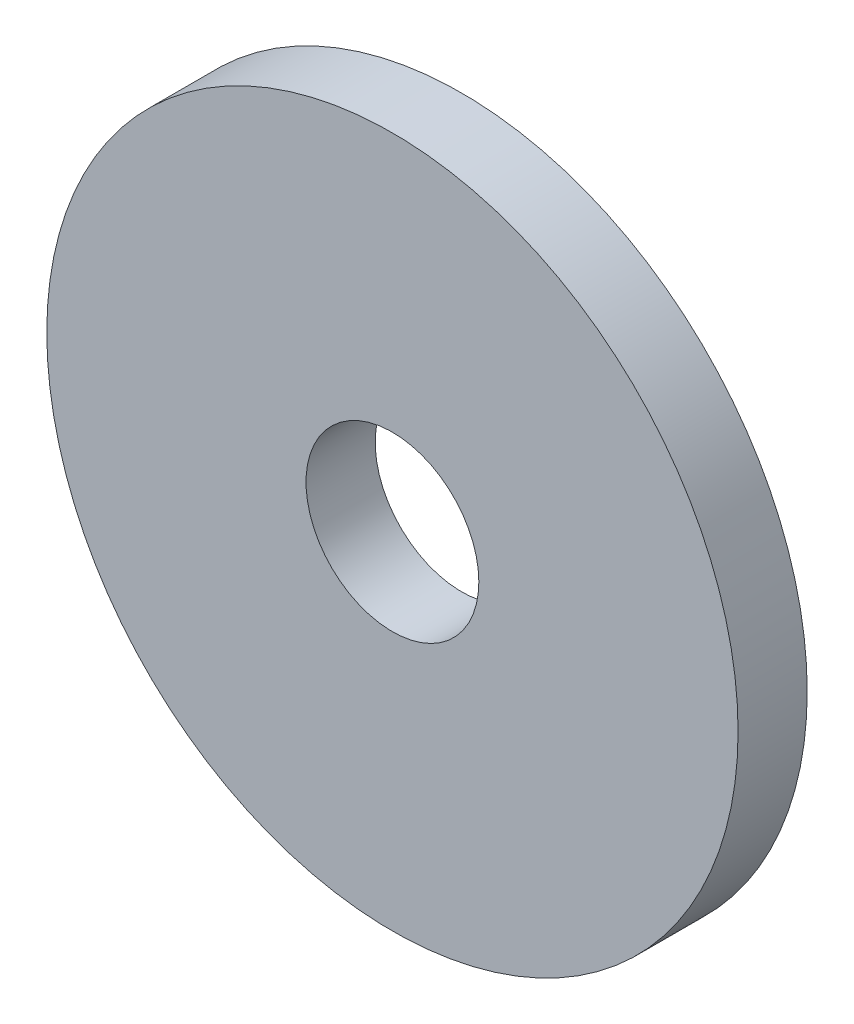
ISO-10303-21;
HEADER;
FILE_DESCRIPTION(('STEP AP214'),'2;1');
FILE_NAME('part.step','',(''),(''),'','','');
FILE_SCHEMA(('AUTOMOTIVE_DESIGN { 1 0 10303 214 1 1 1 1 }'));
ENDSEC;
DATA;
#1=APPLICATION_CONTEXT('core data for automotive mechanical design processes');
#2=APPLICATION_PROTOCOL_DEFINITION('international standard','automotive_design',2000,#1);
#3=PRODUCT_CONTEXT('',#1,'mechanical');
#4=PRODUCT('Part','Part','',(#3));
#5=PRODUCT_RELATED_PRODUCT_CATEGORY('part','',(#4));
#6=PRODUCT_DEFINITION_FORMATION('','',#4);
#7=PRODUCT_DEFINITION_CONTEXT('part definition',#1,'design');
#8=PRODUCT_DEFINITION('design','',#6,#7);
#9=PRODUCT_DEFINITION_SHAPE('','',#8);
#10=(LENGTH_UNIT() NAMED_UNIT(*) SI_UNIT(.MILLI.,.METRE.));
#11=(NAMED_UNIT(*) PLANE_ANGLE_UNIT() SI_UNIT($,.RADIAN.));
#12=(NAMED_UNIT(*) SI_UNIT($,.STERADIAN.) SOLID_ANGLE_UNIT());
#13=UNCERTAINTY_MEASURE_WITH_UNIT(LENGTH_MEASURE(1.E-05),#10,'distance_accuracy_value','');
#14=(GEOMETRIC_REPRESENTATION_CONTEXT(3) GLOBAL_UNCERTAINTY_ASSIGNED_CONTEXT((#13)) GLOBAL_UNIT_ASSIGNED_CONTEXT((#10,
#11,#12)) REPRESENTATION_CONTEXT('',''));
#15=CARTESIAN_POINT('',(0.,0.,0.));
#16=DIRECTION('',(0.,0.,1.));
#17=DIRECTION('',(1.,0.,0.));
#18=AXIS2_PLACEMENT_3D('',#15,#16,#17);
#19=CARTESIAN_POINT('',(0.,0.,2.));
#20=DIRECTION('',(0.,0.,-1.));
#21=DIRECTION('',(-1.,0.,0.));
#22=AXIS2_PLACEMENT_3D('',#19,#20,#21);
#23=CYLINDRICAL_SURFACE('',#22,10.);
#24=CARTESIAN_POINT('',(0.,0.,2.));
#25=DIRECTION('',(0.,0.,1.));
#26=DIRECTION('',(1.,0.,0.));
#27=AXIS2_PLACEMENT_3D('',#24,#25,#26);
#28=CIRCLE('',#27,10.);
#29=CARTESIAN_POINT('',(10.,0.,2.));
#30=VERTEX_POINT('',#29);
#31=EDGE_CURVE('E10',#30,#30,#28,.T.);
#32=ORIENTED_EDGE('',*,*,#31,.F.);
#33=EDGE_LOOP('',(#32));
#34=FACE_BOUND('',#33,.T.);
#35=CARTESIAN_POINT('',(0.,0.,0.));
#36=DIRECTION('',(0.,0.,1.));
#37=DIRECTION('',(1.,0.,0.));
#38=AXIS2_PLACEMENT_3D('',#35,#36,#37);
#39=CIRCLE('',#38,10.);
#40=CARTESIAN_POINT('',(10.,0.,0.));
#41=VERTEX_POINT('',#40);
#42=EDGE_CURVE('E40',#41,#41,#39,.T.);
#43=ORIENTED_EDGE('',*,*,#42,.T.);
#44=EDGE_LOOP('',(#43));
#45=FACE_BOUND('',#44,.T.);
#46=ADVANCED_FACE('F37',(#34,#45),#23,.T.);
#47=CARTESIAN_POINT('',(0.,0.,2.));
#48=DIRECTION('',(0.,0.,1.));
#49=DIRECTION('',(1.,0.,0.));
#50=AXIS2_PLACEMENT_3D('',#47,#48,#49);
#51=PLANE('',#50);
#52=CARTESIAN_POINT('',(0.,0.,2.));
#53=DIRECTION('',(0.,0.,1.));
#54=DIRECTION('',(1.,0.,0.));
#55=AXIS2_PLACEMENT_3D('',#52,#53,#54);
#56=CIRCLE('',#55,2.5);
#57=CARTESIAN_POINT('',(2.5,0.,2.));
#58=VERTEX_POINT('',#57);
#59=EDGE_CURVE('E51',#58,#58,#56,.T.);
#60=ORIENTED_EDGE('',*,*,#59,.F.);
#61=EDGE_LOOP('',(#60));
#62=FACE_BOUND('',#61,.T.);
#63=ORIENTED_EDGE('',*,*,#31,.T.);
#64=EDGE_LOOP('',(#63));
#65=FACE_BOUND('',#64,.T.);
#66=ADVANCED_FACE('F68',(#62,#65),#51,.T.);
#67=CARTESIAN_POINT('',(0.,0.,0.));
#68=DIRECTION('',(0.,0.,1.));
#69=DIRECTION('',(1.,0.,0.));
#70=AXIS2_PLACEMENT_3D('',#67,#68,#69);
#71=PLANE('',#70);
#72=CARTESIAN_POINT('',(0.,0.,0.));
#73=DIRECTION('',(0.,0.,1.));
#74=DIRECTION('',(1.,0.,0.));
#75=AXIS2_PLACEMENT_3D('',#72,#73,#74);
#76=CIRCLE('',#75,2.5);
#77=CARTESIAN_POINT('',(2.5,0.,0.));
#78=VERTEX_POINT('',#77);
#79=EDGE_CURVE('E49',#78,#78,#76,.T.);
#80=ORIENTED_EDGE('',*,*,#79,.T.);
#81=EDGE_LOOP('',(#80));
#82=FACE_BOUND('',#81,.T.);
#83=ORIENTED_EDGE('',*,*,#42,.F.);
#84=EDGE_LOOP('',(#83));
#85=FACE_BOUND('',#84,.T.);
#86=ADVANCED_FACE('F59',(#82,#85),#71,.F.);
#87=CARTESIAN_POINT('',(0.,0.,0.));
#88=DIRECTION('',(0.,0.,1.));
#89=DIRECTION('',(1.,0.,0.));
#90=AXIS2_PLACEMENT_3D('',#87,#88,#89);
#91=CYLINDRICAL_SURFACE('',#90,2.5);
#92=ORIENTED_EDGE('',*,*,#79,.F.);
#93=EDGE_LOOP('',(#92));
#94=FACE_BOUND('',#93,.T.);
#95=ORIENTED_EDGE('',*,*,#59,.T.);
#96=EDGE_LOOP('',(#95));
#97=FACE_BOUND('',#96,.T.);
#98=ADVANCED_FACE('F62',(#94,#97),#91,.F.);
#99=CLOSED_SHELL('',(#46,#66,#86,#98));
#100=MANIFOLD_SOLID_BREP('B2',#99);
#101=ADVANCED_BREP_SHAPE_REPRESENTATION('',(#18,#100),#14);
#102=SHAPE_DEFINITION_REPRESENTATION(#9,#101);
ENDSEC;
END-ISO-10303-21;
